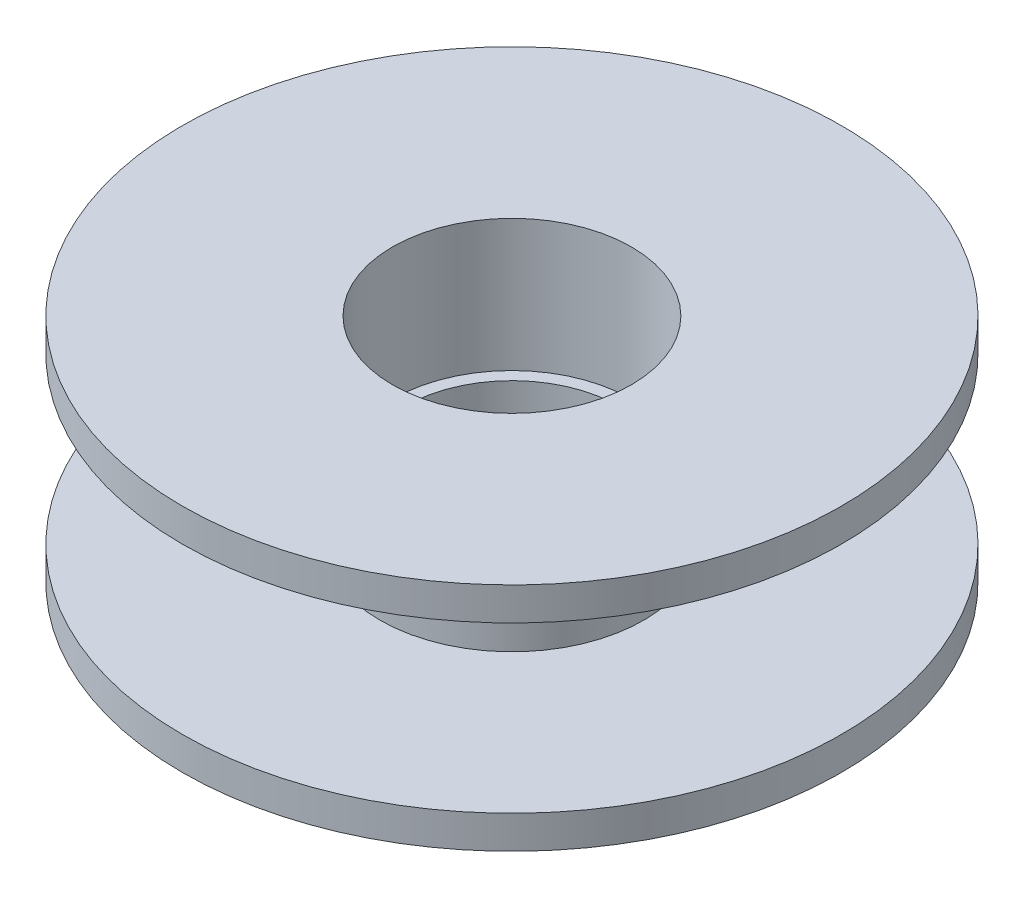
ISO-10303-21;
HEADER;
FILE_DESCRIPTION(('STEP AP214'),'2;1');
FILE_NAME('part.step','',(''),(''),'','','');
FILE_SCHEMA(('AUTOMOTIVE_DESIGN { 1 0 10303 214 1 1 1 1 }'));
ENDSEC;
DATA;
#1=APPLICATION_CONTEXT('core data for automotive mechanical design processes');
#2=APPLICATION_PROTOCOL_DEFINITION('international standard','automotive_design',2000,#1);
#3=PRODUCT_CONTEXT('',#1,'mechanical');
#4=PRODUCT('Part','Part','',(#3));
#5=PRODUCT_RELATED_PRODUCT_CATEGORY('part','',(#4));
#6=PRODUCT_DEFINITION_FORMATION('','',#4);
#7=PRODUCT_DEFINITION_CONTEXT('part definition',#1,'design');
#8=PRODUCT_DEFINITION('design','',#6,#7);
#9=PRODUCT_DEFINITION_SHAPE('','',#8);
#10=(LENGTH_UNIT() NAMED_UNIT(*) SI_UNIT(.MILLI.,.METRE.));
#11=(NAMED_UNIT(*) PLANE_ANGLE_UNIT() SI_UNIT($,.RADIAN.));
#12=(NAMED_UNIT(*) SI_UNIT($,.STERADIAN.) SOLID_ANGLE_UNIT());
#13=UNCERTAINTY_MEASURE_WITH_UNIT(LENGTH_MEASURE(1.E-05),#10,'distance_accuracy_value','');
#14=(GEOMETRIC_REPRESENTATION_CONTEXT(3) GLOBAL_UNCERTAINTY_ASSIGNED_CONTEXT((#13)) GLOBAL_UNIT_ASSIGNED_CONTEXT((#10,
#11,#12)) REPRESENTATION_CONTEXT('',''));
#15=CARTESIAN_POINT('',(0.,0.,0.));
#16=DIRECTION('',(0.,0.,1.));
#17=DIRECTION('',(1.,0.,0.));
#18=AXIS2_PLACEMENT_3D('',#15,#16,#17);
#19=CARTESIAN_POINT('',(0.,28.0586262240942,0.));
#20=DIRECTION('',(0.,1.,0.));
#21=DIRECTION('',(0.,0.,1.));
#22=AXIS2_PLACEMENT_3D('',#19,#20,#21);
#23=CYLINDRICAL_SURFACE('',#22,14.5);
#24=CARTESIAN_POINT('',(0.,17.8386588718912,0.));
#25=DIRECTION('',(0.,1.,0.));
#26=DIRECTION('',(0.,0.,1.));
#27=AXIS2_PLACEMENT_3D('',#24,#25,#26);
#28=CIRCLE('',#27,14.5);
#29=CARTESIAN_POINT('',(0.,17.8386588718912,14.5));
#30=VERTEX_POINT('',#29);
#31=EDGE_CURVE('E10',#30,#30,#28,.T.);
#32=ORIENTED_EDGE('',*,*,#31,.F.);
#33=EDGE_LOOP('',(#32));
#34=FACE_BOUND('',#33,.T.);
#35=CARTESIAN_POINT('',(0.,33.8386588718912,0.));
#36=DIRECTION('',(0.,1.,0.));
#37=DIRECTION('',(0.,0.,1.));
#38=AXIS2_PLACEMENT_3D('',#35,#36,#37);
#39=CIRCLE('',#38,14.5);
#40=CARTESIAN_POINT('',(0.,33.8386588718912,14.5));
#41=VERTEX_POINT('',#40);
#42=EDGE_CURVE('E37',#41,#41,#39,.F.);
#43=ORIENTED_EDGE('',*,*,#42,.F.);
#44=EDGE_LOOP('',(#43));
#45=FACE_BOUND('',#44,.T.);
#46=ADVANCED_FACE('F34',(#34,#45),#23,.F.);
#47=CARTESIAN_POINT('',(0.,17.8386588718912,13.));
#48=DIRECTION('',(0.,1.,0.));
#49=DIRECTION('',(0.,0.,1.));
#50=AXIS2_PLACEMENT_3D('',#47,#48,#49);
#51=PLANE('',#50);
#52=ORIENTED_EDGE('',*,*,#31,.T.);
#53=EDGE_LOOP('',(#52));
#54=FACE_BOUND('',#53,.T.);
#55=CARTESIAN_POINT('',(0.,17.8386588718912,0.));
#56=DIRECTION('',(0.,1.,0.));
#57=DIRECTION('',(0.,0.,1.));
#58=AXIS2_PLACEMENT_3D('',#55,#56,#57);
#59=CIRCLE('',#58,13.);
#60=CARTESIAN_POINT('',(0.,17.8386588718912,13.));
#61=VERTEX_POINT('',#60);
#62=EDGE_CURVE('E41',#61,#61,#59,.T.);
#63=ORIENTED_EDGE('',*,*,#62,.F.);
#64=EDGE_LOOP('',(#63));
#65=FACE_BOUND('',#64,.T.);
#66=ADVANCED_FACE('F76',(#54,#65),#51,.T.);
#67=CARTESIAN_POINT('',(0.,28.0586262240942,0.));
#68=DIRECTION('',(0.,1.,0.));
#69=DIRECTION('',(0.,0.,1.));
#70=AXIS2_PLACEMENT_3D('',#67,#68,#69);
#71=CYLINDRICAL_SURFACE('',#70,13.);
#72=ORIENTED_EDGE('',*,*,#62,.T.);
#73=EDGE_LOOP('',(#72));
#74=FACE_BOUND('',#73,.T.);
#75=CARTESIAN_POINT('',(0.,5.83865887189124,0.));
#76=DIRECTION('',(0.,1.,0.));
#77=DIRECTION('',(0.,0.,1.));
#78=AXIS2_PLACEMENT_3D('',#75,#76,#77);
#79=CIRCLE('',#78,13.);
#80=CARTESIAN_POINT('',(0.,5.83865887189124,13.));
#81=VERTEX_POINT('',#80);
#82=EDGE_CURVE('E45',#81,#81,#79,.T.);
#83=ORIENTED_EDGE('',*,*,#82,.F.);
#84=EDGE_LOOP('',(#83));
#85=FACE_BOUND('',#84,.T.);
#86=ADVANCED_FACE('F81',(#74,#85),#71,.F.);
#87=CARTESIAN_POINT('',(0.,5.83865887189124,40.));
#88=DIRECTION('',(0.,-1.,0.));
#89=DIRECTION('',(0.,0.,-1.));
#90=AXIS2_PLACEMENT_3D('',#87,#88,#89);
#91=PLANE('',#90);
#92=ORIENTED_EDGE('',*,*,#82,.T.);
#93=EDGE_LOOP('',(#92));
#94=FACE_BOUND('',#93,.T.);
#95=CARTESIAN_POINT('',(0.,5.83865887189124,0.));
#96=DIRECTION('',(0.,1.,0.));
#97=DIRECTION('',(0.,0.,1.));
#98=AXIS2_PLACEMENT_3D('',#95,#96,#97);
#99=CIRCLE('',#98,40.);
#100=CARTESIAN_POINT('',(0.,5.83865887189124,40.));
#101=VERTEX_POINT('',#100);
#102=EDGE_CURVE('E50',#101,#101,#99,.T.);
#103=ORIENTED_EDGE('',*,*,#102,.F.);
#104=EDGE_LOOP('',(#103));
#105=FACE_BOUND('',#104,.T.);
#106=ADVANCED_FACE('F85',(#94,#105),#91,.T.);
#107=CARTESIAN_POINT('',(0.,28.0586262240942,0.));
#108=DIRECTION('',(0.,1.,0.));
#109=DIRECTION('',(0.,0.,1.));
#110=AXIS2_PLACEMENT_3D('',#107,#108,#109);
#111=CYLINDRICAL_SURFACE('',#110,40.);
#112=ORIENTED_EDGE('',*,*,#102,.T.);
#113=EDGE_LOOP('',(#112));
#114=FACE_BOUND('',#113,.T.);
#115=CARTESIAN_POINT('',(0.,9.83865887189124,0.));
#116=DIRECTION('',(0.,1.,0.));
#117=DIRECTION('',(0.,0.,1.));
#118=AXIS2_PLACEMENT_3D('',#115,#116,#117);
#119=CIRCLE('',#118,40.);
#120=CARTESIAN_POINT('',(0.,9.83865887189124,40.));
#121=VERTEX_POINT('',#120);
#122=EDGE_CURVE('E53',#121,#121,#119,.T.);
#123=ORIENTED_EDGE('',*,*,#122,.F.);
#124=EDGE_LOOP('',(#123));
#125=FACE_BOUND('',#124,.T.);
#126=ADVANCED_FACE('F92',(#114,#125),#111,.T.);
#127=CARTESIAN_POINT('',(0.,9.83865887189124,16.));
#128=DIRECTION('',(0.,1.,0.));
#129=DIRECTION('',(0.,0.,1.));
#130=AXIS2_PLACEMENT_3D('',#127,#128,#129);
#131=PLANE('',#130);
#132=ORIENTED_EDGE('',*,*,#122,.T.);
#133=EDGE_LOOP('',(#132));
#134=FACE_BOUND('',#133,.T.);
#135=CARTESIAN_POINT('',(0.,9.83865887189124,0.));
#136=DIRECTION('',(0.,1.,0.));
#137=DIRECTION('',(0.,0.,1.));
#138=AXIS2_PLACEMENT_3D('',#135,#136,#137);
#139=CIRCLE('',#138,16.);
#140=CARTESIAN_POINT('',(0.,9.83865887189124,16.));
#141=VERTEX_POINT('',#140);
#142=EDGE_CURVE('E56',#141,#141,#139,.T.);
#143=ORIENTED_EDGE('',*,*,#142,.F.);
#144=EDGE_LOOP('',(#143));
#145=FACE_BOUND('',#144,.T.);
#146=ADVANCED_FACE('F96',(#134,#145),#131,.T.);
#147=CARTESIAN_POINT('',(0.,28.0586262240942,0.));
#148=DIRECTION('',(0.,1.,0.));
#149=DIRECTION('',(0.,0.,1.));
#150=AXIS2_PLACEMENT_3D('',#147,#148,#149);
#151=CYLINDRICAL_SURFACE('',#150,16.);
#152=ORIENTED_EDGE('',*,*,#142,.T.);
#153=EDGE_LOOP('',(#152));
#154=FACE_BOUND('',#153,.T.);
#155=CARTESIAN_POINT('',(0.,29.8386588718912,0.));
#156=DIRECTION('',(0.,1.,0.));
#157=DIRECTION('',(0.,0.,1.));
#158=AXIS2_PLACEMENT_3D('',#155,#156,#157);
#159=CIRCLE('',#158,16.);
#160=CARTESIAN_POINT('',(0.,29.8386588718912,16.));
#161=VERTEX_POINT('',#160);
#162=EDGE_CURVE('E59',#161,#161,#159,.T.);
#163=ORIENTED_EDGE('',*,*,#162,.F.);
#164=EDGE_LOOP('',(#163));
#165=FACE_BOUND('',#164,.T.);
#166=ADVANCED_FACE('F100',(#154,#165),#151,.T.);
#167=CARTESIAN_POINT('',(0.,33.8386588718912,40.));
#168=DIRECTION('',(0.,1.,0.));
#169=DIRECTION('',(0.,0.,-1.));
#170=AXIS2_PLACEMENT_3D('',#167,#168,#169);
#171=PLANE('',#170);
#172=ORIENTED_EDGE('',*,*,#42,.T.);
#173=EDGE_LOOP('',(#172));
#174=FACE_BOUND('',#173,.T.);
#175=CARTESIAN_POINT('',(0.,33.8386588718912,0.));
#176=DIRECTION('',(0.,1.,0.));
#177=DIRECTION('',(0.,0.,1.));
#178=AXIS2_PLACEMENT_3D('',#175,#176,#177);
#179=CIRCLE('',#178,40.);
#180=CARTESIAN_POINT('',(0.,33.8386588718912,40.));
#181=VERTEX_POINT('',#180);
#182=EDGE_CURVE('E62',#181,#181,#179,.T.);
#183=ORIENTED_EDGE('',*,*,#182,.T.);
#184=EDGE_LOOP('',(#183));
#185=FACE_BOUND('',#184,.T.);
#186=ADVANCED_FACE('F72',(#174,#185),#171,.T.);
#187=CARTESIAN_POINT('',(0.,11.6186915196882,0.));
#188=DIRECTION('',(0.,-1.,0.));
#189=DIRECTION('',(0.,0.,1.));
#190=AXIS2_PLACEMENT_3D('',#187,#188,#189);
#191=CYLINDRICAL_SURFACE('',#190,40.);
#192=ORIENTED_EDGE('',*,*,#182,.F.);
#193=EDGE_LOOP('',(#192));
#194=FACE_BOUND('',#193,.T.);
#195=CARTESIAN_POINT('',(0.,29.8386588718912,0.));
#196=DIRECTION('',(0.,1.,0.));
#197=DIRECTION('',(0.,0.,1.));
#198=AXIS2_PLACEMENT_3D('',#195,#196,#197);
#199=CIRCLE('',#198,40.);
#200=CARTESIAN_POINT('',(0.,29.8386588718912,40.));
#201=VERTEX_POINT('',#200);
#202=EDGE_CURVE('E65',#201,#201,#199,.T.);
#203=ORIENTED_EDGE('',*,*,#202,.T.);
#204=EDGE_LOOP('',(#203));
#205=FACE_BOUND('',#204,.T.);
#206=ADVANCED_FACE('F107',(#194,#205),#191,.T.);
#207=CARTESIAN_POINT('',(0.,29.8386588718912,16.));
#208=DIRECTION('',(0.,-1.,0.));
#209=DIRECTION('',(0.,0.,1.));
#210=AXIS2_PLACEMENT_3D('',#207,#208,#209);
#211=PLANE('',#210);
#212=ORIENTED_EDGE('',*,*,#202,.F.);
#213=EDGE_LOOP('',(#212));
#214=FACE_BOUND('',#213,.T.);
#215=ORIENTED_EDGE('',*,*,#162,.T.);
#216=EDGE_LOOP('',(#215));
#217=FACE_BOUND('',#216,.T.);
#218=ADVANCED_FACE('F110',(#214,#217),#211,.T.);
#219=CLOSED_SHELL('',(#46,#66,#86,#106,#126,#146,#166,#186,#206,#218));
#220=MANIFOLD_SOLID_BREP('B2',#219);
#221=ADVANCED_BREP_SHAPE_REPRESENTATION('',(#18,#220),#14);
#222=SHAPE_DEFINITION_REPRESENTATION(#9,#221);
ENDSEC;
END-ISO-10303-21;
